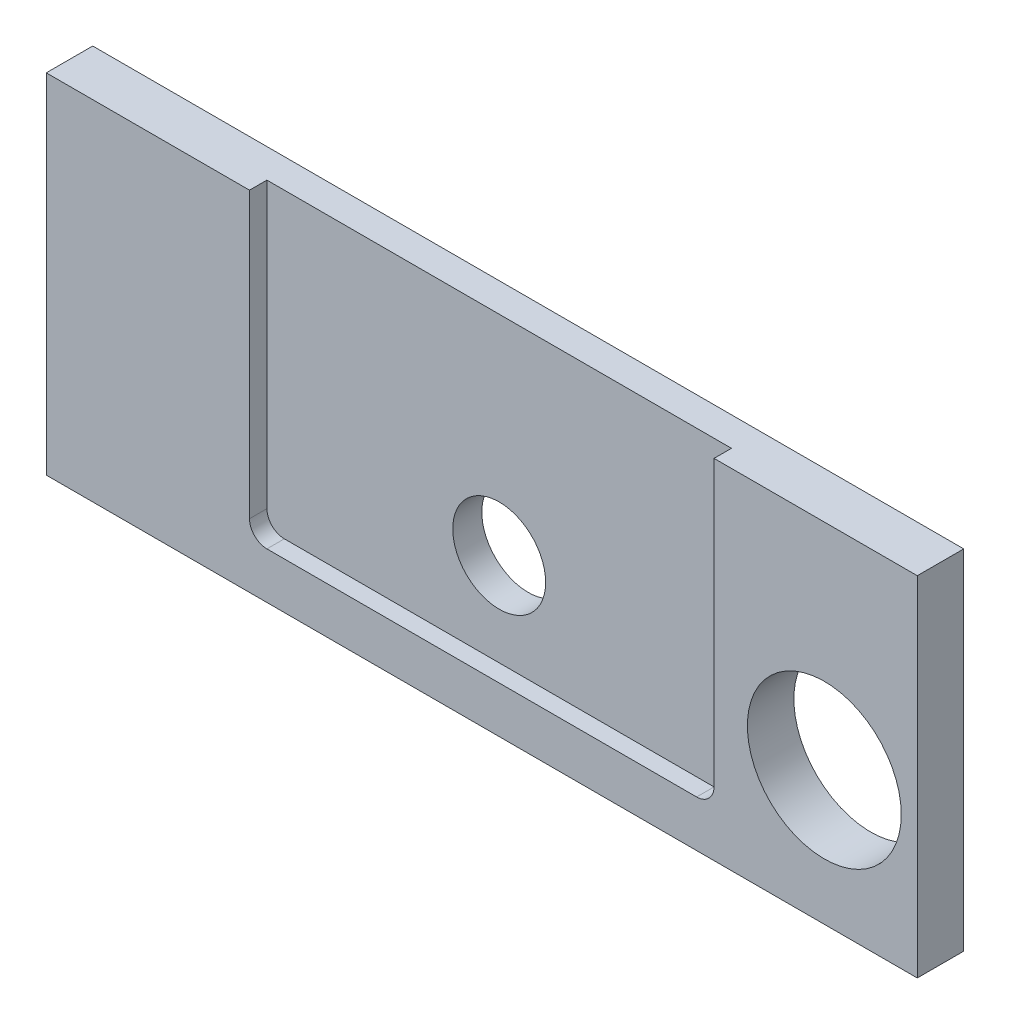
ISO-10303-21;
HEADER;
FILE_DESCRIPTION(('STEP AP214'),'2;1');
FILE_NAME('part.step','',(''),(''),'','','');
FILE_SCHEMA(('AUTOMOTIVE_DESIGN { 1 0 10303 214 1 1 1 1 }'));
ENDSEC;
DATA;
#1=APPLICATION_CONTEXT('core data for automotive mechanical design processes');
#2=APPLICATION_PROTOCOL_DEFINITION('international standard','automotive_design',2000,#1);
#3=PRODUCT_CONTEXT('',#1,'mechanical');
#4=PRODUCT('Part','Part','',(#3));
#5=PRODUCT_RELATED_PRODUCT_CATEGORY('part','',(#4));
#6=PRODUCT_DEFINITION_FORMATION('','',#4);
#7=PRODUCT_DEFINITION_CONTEXT('part definition',#1,'design');
#8=PRODUCT_DEFINITION('design','',#6,#7);
#9=PRODUCT_DEFINITION_SHAPE('','',#8);
#10=(LENGTH_UNIT() NAMED_UNIT(*) SI_UNIT(.MILLI.,.METRE.));
#11=(NAMED_UNIT(*) PLANE_ANGLE_UNIT() SI_UNIT($,.RADIAN.));
#12=(NAMED_UNIT(*) SI_UNIT($,.STERADIAN.) SOLID_ANGLE_UNIT());
#13=UNCERTAINTY_MEASURE_WITH_UNIT(LENGTH_MEASURE(1.E-05),#10,'distance_accuracy_value','');
#14=(GEOMETRIC_REPRESENTATION_CONTEXT(3) GLOBAL_UNCERTAINTY_ASSIGNED_CONTEXT((#13)) GLOBAL_UNIT_ASSIGNED_CONTEXT((#10,
#11,#12)) REPRESENTATION_CONTEXT('',''));
#15=CARTESIAN_POINT('',(0.,0.,0.));
#16=DIRECTION('',(0.,0.,1.));
#17=DIRECTION('',(1.,0.,0.));
#18=AXIS2_PLACEMENT_3D('',#15,#16,#17);
#19=CARTESIAN_POINT('',(115.,60.,5.));
#20=DIRECTION('',(1.,0.,0.));
#21=DIRECTION('',(0.,1.,0.));
#22=AXIS2_PLACEMENT_3D('',#19,#20,#21);
#23=PLANE('',#22);
#24=DIRECTION('',(0.,1.,0.));
#25=VECTOR('',#24,1.);
#26=CARTESIAN_POINT('',(115.,60.,5.));
#27=LINE('',#26,#25);
#28=CARTESIAN_POINT('',(115.,11.,5.));
#29=VERTEX_POINT('',#28);
#30=CARTESIAN_POINT('',(115.,60.,5.));
#31=VERTEX_POINT('',#30);
#32=EDGE_CURVE('E112',#29,#31,#27,.T.);
#33=ORIENTED_EDGE('',*,*,#32,.F.);
#34=DIRECTION('',(0.,0.,-1.));
#35=VECTOR('',#34,1.);
#36=CARTESIAN_POINT('',(115.,11.,8.));
#37=LINE('',#36,#35);
#38=CARTESIAN_POINT('',(115.,11.,8.));
#39=VERTEX_POINT('',#38);
#40=EDGE_CURVE('E49',#29,#39,#37,.F.);
#41=ORIENTED_EDGE('',*,*,#40,.T.);
#42=DIRECTION('',(0.,1.,0.));
#43=VECTOR('',#42,1.);
#44=CARTESIAN_POINT('',(115.,60.,8.));
#45=LINE('',#44,#43);
#46=CARTESIAN_POINT('',(115.,60.,8.));
#47=VERTEX_POINT('',#46);
#48=EDGE_CURVE('E125',#39,#47,#45,.T.);
#49=ORIENTED_EDGE('',*,*,#48,.T.);
#50=DIRECTION('',(0.,0.,1.));
#51=VECTOR('',#50,1.);
#52=CARTESIAN_POINT('',(115.,60.,5.));
#53=LINE('',#52,#51);
#54=EDGE_CURVE('E124',#31,#47,#53,.T.);
#55=ORIENTED_EDGE('',*,*,#54,.F.);
#56=EDGE_LOOP('',(#33,#41,#49,#55));
#57=FACE_BOUND('',#56,.T.);
#58=ADVANCED_FACE('F34',(#57),#23,.F.);
#59=CARTESIAN_POINT('',(35.,60.,5.));
#60=DIRECTION('',(-1.,0.,0.));
#61=DIRECTION('',(0.,-1.,0.));
#62=AXIS2_PLACEMENT_3D('',#59,#60,#61);
#63=PLANE('',#62);
#64=DIRECTION('',(0.,-1.,0.));
#65=VECTOR('',#64,1.);
#66=CARTESIAN_POINT('',(35.,60.,8.));
#67=LINE('',#66,#65);
#68=CARTESIAN_POINT('',(35.,60.,8.));
#69=VERTEX_POINT('',#68);
#70=CARTESIAN_POINT('',(35.,11.,8.));
#71=VERTEX_POINT('',#70);
#72=EDGE_CURVE('E121',#69,#71,#67,.T.);
#73=ORIENTED_EDGE('',*,*,#72,.T.);
#74=DIRECTION('',(0.,0.,-1.));
#75=VECTOR('',#74,1.);
#76=CARTESIAN_POINT('',(35.,11.,5.));
#77=LINE('',#76,#75);
#78=CARTESIAN_POINT('',(35.,11.,5.));
#79=VERTEX_POINT('',#78);
#80=EDGE_CURVE('E174',#71,#79,#77,.T.);
#81=ORIENTED_EDGE('',*,*,#80,.T.);
#82=DIRECTION('',(0.,-1.,0.));
#83=VECTOR('',#82,1.);
#84=CARTESIAN_POINT('',(35.,60.,5.));
#85=LINE('',#84,#83);
#86=CARTESIAN_POINT('',(35.,60.,5.));
#87=VERTEX_POINT('',#86);
#88=EDGE_CURVE('E130',#87,#79,#85,.T.);
#89=ORIENTED_EDGE('',*,*,#88,.F.);
#90=DIRECTION('',(0.,0.,1.));
#91=VECTOR('',#90,1.);
#92=CARTESIAN_POINT('',(35.,60.,5.));
#93=LINE('',#92,#91);
#94=EDGE_CURVE('E129',#87,#69,#93,.T.);
#95=ORIENTED_EDGE('',*,*,#94,.T.);
#96=EDGE_LOOP('',(#73,#81,#89,#95));
#97=FACE_BOUND('',#96,.T.);
#98=ADVANCED_FACE('F195',(#97),#63,.F.);
#99=CARTESIAN_POINT('',(0.,0.,5.));
#100=DIRECTION('',(0.,0.,1.));
#101=DIRECTION('',(1.,0.,0.));
#102=AXIS2_PLACEMENT_3D('',#99,#100,#101);
#103=PLANE('',#102);
#104=CARTESIAN_POINT('',(75.,24.,5.));
#105=DIRECTION('',(0.,0.,1.));
#106=DIRECTION('',(1.,0.,0.));
#107=AXIS2_PLACEMENT_3D('',#104,#105,#106);
#108=CIRCLE('',#107,8.00000000000001);
#109=CARTESIAN_POINT('',(83.,24.,5.));
#110=VERTEX_POINT('',#109);
#111=EDGE_CURVE('E139',#110,#110,#108,.T.);
#112=ORIENTED_EDGE('',*,*,#111,.F.);
#113=EDGE_LOOP('',(#112));
#114=FACE_BOUND('',#113,.T.);
#115=ORIENTED_EDGE('',*,*,#88,.T.);
#116=CARTESIAN_POINT('',(38.,11.,5.));
#117=DIRECTION('',(0.,0.,1.));
#118=DIRECTION('',(1.,0.,0.));
#119=AXIS2_PLACEMENT_3D('',#116,#117,#118);
#120=CIRCLE('',#119,3.);
#121=CARTESIAN_POINT('',(38.,8.,5.));
#122=VERTEX_POINT('',#121);
#123=EDGE_CURVE('E181',#79,#122,#120,.T.);
#124=ORIENTED_EDGE('',*,*,#123,.T.);
#125=DIRECTION('',(-1.,0.,0.));
#126=VECTOR('',#125,1.);
#127=CARTESIAN_POINT('',(35.,8.,5.));
#128=LINE('',#127,#126);
#129=CARTESIAN_POINT('',(112.,8.,5.));
#130=VERTEX_POINT('',#129);
#131=EDGE_CURVE('E197',#130,#122,#128,.T.);
#132=ORIENTED_EDGE('',*,*,#131,.F.);
#133=CARTESIAN_POINT('',(112.,11.,5.));
#134=DIRECTION('',(0.,0.,1.));
#135=DIRECTION('',(1.,0.,0.));
#136=AXIS2_PLACEMENT_3D('',#133,#134,#135);
#137=CIRCLE('',#136,3.);
#138=EDGE_CURVE('E120',#130,#29,#137,.T.);
#139=ORIENTED_EDGE('',*,*,#138,.T.);
#140=ORIENTED_EDGE('',*,*,#32,.T.);
#141=DIRECTION('',(-1.,0.,0.));
#142=VECTOR('',#141,1.);
#143=CARTESIAN_POINT('',(115.,60.,5.));
#144=LINE('',#143,#142);
#145=EDGE_CURVE('E117',#31,#87,#144,.T.);
#146=ORIENTED_EDGE('',*,*,#145,.T.);
#147=EDGE_LOOP('',(#115,#124,#132,#139,#140,#146));
#148=FACE_BOUND('',#147,.T.);
#149=ADVANCED_FACE('F115',(#114,#148),#103,.T.);
#150=CARTESIAN_POINT('',(0.,0.,8.));
#151=DIRECTION('',(1.,0.,0.));
#152=DIRECTION('',(0.,0.,-1.));
#153=AXIS2_PLACEMENT_3D('',#150,#151,#152);
#154=PLANE('',#153);
#155=DIRECTION('',(0.,-1.,0.));
#156=VECTOR('',#155,1.);
#157=CARTESIAN_POINT('',(0.,0.,0.));
#158=LINE('',#157,#156);
#159=CARTESIAN_POINT('',(0.,60.,0.));
#160=VERTEX_POINT('',#159);
#161=CARTESIAN_POINT('',(0.,0.,0.));
#162=VERTEX_POINT('',#161);
#163=EDGE_CURVE('E142',#160,#162,#158,.T.);
#164=ORIENTED_EDGE('',*,*,#163,.T.);
#165=DIRECTION('',(0.,0.,-1.));
#166=VECTOR('',#165,1.);
#167=CARTESIAN_POINT('',(0.,0.,8.));
#168=LINE('',#167,#166);
#169=CARTESIAN_POINT('',(0.,0.,8.));
#170=VERTEX_POINT('',#169);
#171=EDGE_CURVE('E171',#170,#162,#168,.T.);
#172=ORIENTED_EDGE('',*,*,#171,.F.);
#173=DIRECTION('',(0.,-1.,0.));
#174=VECTOR('',#173,1.);
#175=CARTESIAN_POINT('',(0.,0.,8.));
#176=LINE('',#175,#174);
#177=CARTESIAN_POINT('',(0.,60.,8.));
#178=VERTEX_POINT('',#177);
#179=EDGE_CURVE('E144',#178,#170,#176,.T.);
#180=ORIENTED_EDGE('',*,*,#179,.F.);
#181=DIRECTION('',(0.,0.,-1.));
#182=VECTOR('',#181,1.);
#183=CARTESIAN_POINT('',(0.,60.,8.));
#184=LINE('',#183,#182);
#185=EDGE_CURVE('E155',#178,#160,#184,.T.);
#186=ORIENTED_EDGE('',*,*,#185,.T.);
#187=EDGE_LOOP('',(#164,#172,#180,#186));
#188=FACE_BOUND('',#187,.T.);
#189=ADVANCED_FACE('F245',(#188),#154,.F.);
#190=CARTESIAN_POINT('',(0.,0.,8.));
#191=DIRECTION('',(0.,1.,0.));
#192=DIRECTION('',(0.,0.,1.));
#193=AXIS2_PLACEMENT_3D('',#190,#191,#192);
#194=PLANE('',#193);
#195=DIRECTION('',(0.,0.,-1.));
#196=VECTOR('',#195,1.);
#197=CARTESIAN_POINT('',(150.,0.,8.));
#198=LINE('',#197,#196);
#199=CARTESIAN_POINT('',(150.,0.,8.));
#200=VERTEX_POINT('',#199);
#201=CARTESIAN_POINT('',(150.,0.,0.));
#202=VERTEX_POINT('',#201);
#203=EDGE_CURVE('E168',#200,#202,#198,.T.);
#204=ORIENTED_EDGE('',*,*,#203,.F.);
#205=DIRECTION('',(1.,0.,0.));
#206=VECTOR('',#205,1.);
#207=CARTESIAN_POINT('',(0.,0.,8.));
#208=LINE('',#207,#206);
#209=EDGE_CURVE('E147',#170,#200,#208,.T.);
#210=ORIENTED_EDGE('',*,*,#209,.F.);
#211=ORIENTED_EDGE('',*,*,#171,.T.);
#212=DIRECTION('',(1.,0.,0.));
#213=VECTOR('',#212,1.);
#214=CARTESIAN_POINT('',(0.,0.,0.));
#215=LINE('',#214,#213);
#216=EDGE_CURVE('E158',#162,#202,#215,.T.);
#217=ORIENTED_EDGE('',*,*,#216,.T.);
#218=EDGE_LOOP('',(#204,#210,#211,#217));
#219=FACE_BOUND('',#218,.T.);
#220=ADVANCED_FACE('F241',(#219),#194,.F.);
#221=CARTESIAN_POINT('',(150.,0.,8.));
#222=DIRECTION('',(-1.,0.,0.));
#223=DIRECTION('',(0.,0.,1.));
#224=AXIS2_PLACEMENT_3D('',#221,#222,#223);
#225=PLANE('',#224);
#226=DIRECTION('',(0.,1.,0.));
#227=VECTOR('',#226,1.);
#228=CARTESIAN_POINT('',(150.,0.,0.));
#229=LINE('',#228,#227);
#230=CARTESIAN_POINT('',(150.,60.,0.));
#231=VERTEX_POINT('',#230);
#232=EDGE_CURVE('E160',#202,#231,#229,.T.);
#233=ORIENTED_EDGE('',*,*,#232,.T.);
#234=DIRECTION('',(0.,0.,-1.));
#235=VECTOR('',#234,1.);
#236=CARTESIAN_POINT('',(150.,60.,8.));
#237=LINE('',#236,#235);
#238=CARTESIAN_POINT('',(150.,60.,8.));
#239=VERTEX_POINT('',#238);
#240=EDGE_CURVE('E165',#239,#231,#237,.T.);
#241=ORIENTED_EDGE('',*,*,#240,.F.);
#242=DIRECTION('',(0.,1.,0.));
#243=VECTOR('',#242,1.);
#244=CARTESIAN_POINT('',(150.,0.,8.));
#245=LINE('',#244,#243);
#246=EDGE_CURVE('E150',#200,#239,#245,.T.);
#247=ORIENTED_EDGE('',*,*,#246,.F.);
#248=ORIENTED_EDGE('',*,*,#203,.T.);
#249=EDGE_LOOP('',(#233,#241,#247,#248));
#250=FACE_BOUND('',#249,.T.);
#251=ADVANCED_FACE('F238',(#250),#225,.F.);
#252=CARTESIAN_POINT('',(0.,60.,8.));
#253=DIRECTION('',(0.,-1.,0.));
#254=DIRECTION('',(0.,0.,-1.));
#255=AXIS2_PLACEMENT_3D('',#252,#253,#254);
#256=PLANE('',#255);
#257=ORIENTED_EDGE('',*,*,#145,.F.);
#258=ORIENTED_EDGE('',*,*,#54,.T.);
#259=DIRECTION('',(-1.,0.,0.));
#260=VECTOR('',#259,1.);
#261=CARTESIAN_POINT('',(0.,60.,8.));
#262=LINE('',#261,#260);
#263=EDGE_CURVE('E153',#239,#47,#262,.T.);
#264=ORIENTED_EDGE('',*,*,#263,.F.);
#265=ORIENTED_EDGE('',*,*,#240,.T.);
#266=DIRECTION('',(-1.,0.,0.));
#267=VECTOR('',#266,1.);
#268=CARTESIAN_POINT('',(0.,60.,0.));
#269=LINE('',#268,#267);
#270=EDGE_CURVE('E148',#231,#160,#269,.T.);
#271=ORIENTED_EDGE('',*,*,#270,.T.);
#272=ORIENTED_EDGE('',*,*,#185,.F.);
#273=EDGE_CURVE('E152',#69,#178,#262,.T.);
#274=ORIENTED_EDGE('',*,*,#273,.F.);
#275=ORIENTED_EDGE('',*,*,#94,.F.);
#276=EDGE_LOOP('',(#257,#258,#264,#265,#271,#272,#274,#275));
#277=FACE_BOUND('',#276,.T.);
#278=ADVANCED_FACE('F132',(#277),#256,.F.);
#279=CARTESIAN_POINT('',(0.,0.,8.));
#280=DIRECTION('',(0.,0.,-1.));
#281=DIRECTION('',(-1.,0.,0.));
#282=AXIS2_PLACEMENT_3D('',#279,#280,#281);
#283=PLANE('',#282);
#284=CARTESIAN_POINT('',(133.991524815011,23.,8.));
#285=DIRECTION('',(0.,0.,1.));
#286=DIRECTION('',(1.,0.,0.));
#287=AXIS2_PLACEMENT_3D('',#284,#285,#286);
#288=CIRCLE('',#287,13.25);
#289=CARTESIAN_POINT('',(147.241524815011,23.,8.));
#290=VERTEX_POINT('',#289);
#291=EDGE_CURVE('E204',#290,#290,#288,.T.);
#292=ORIENTED_EDGE('',*,*,#291,.F.);
#293=EDGE_LOOP('',(#292));
#294=FACE_BOUND('',#293,.T.);
#295=ORIENTED_EDGE('',*,*,#209,.T.);
#296=ORIENTED_EDGE('',*,*,#246,.T.);
#297=ORIENTED_EDGE('',*,*,#263,.T.);
#298=ORIENTED_EDGE('',*,*,#48,.F.);
#299=CARTESIAN_POINT('',(112.,11.,8.));
#300=DIRECTION('',(0.,0.,-1.));
#301=DIRECTION('',(-1.,0.,0.));
#302=AXIS2_PLACEMENT_3D('',#299,#300,#301);
#303=CIRCLE('',#302,3.);
#304=CARTESIAN_POINT('',(112.,8.,8.));
#305=VERTEX_POINT('',#304);
#306=EDGE_CURVE('E11',#39,#305,#303,.T.);
#307=ORIENTED_EDGE('',*,*,#306,.T.);
#308=DIRECTION('',(-1.,0.,0.));
#309=VECTOR('',#308,1.);
#310=CARTESIAN_POINT('',(35.,8.,8.));
#311=LINE('',#310,#309);
#312=CARTESIAN_POINT('',(38.,8.,8.));
#313=VERTEX_POINT('',#312);
#314=EDGE_CURVE('E191',#305,#313,#311,.T.);
#315=ORIENTED_EDGE('',*,*,#314,.T.);
#316=CARTESIAN_POINT('',(38.,11.,8.));
#317=DIRECTION('',(0.,0.,-1.));
#318=DIRECTION('',(-1.,0.,0.));
#319=AXIS2_PLACEMENT_3D('',#316,#317,#318);
#320=CIRCLE('',#319,3.);
#321=EDGE_CURVE('E42',#313,#71,#320,.T.);
#322=ORIENTED_EDGE('',*,*,#321,.T.);
#323=ORIENTED_EDGE('',*,*,#72,.F.);
#324=ORIENTED_EDGE('',*,*,#273,.T.);
#325=ORIENTED_EDGE('',*,*,#179,.T.);
#326=EDGE_LOOP('',(#295,#296,#297,#298,#307,#315,#322,#323,#324,#325));
#327=FACE_BOUND('',#326,.T.);
#328=ADVANCED_FACE('F190',(#294,#327),#283,.F.);
#329=CARTESIAN_POINT('',(0.,0.,0.));
#330=DIRECTION('',(0.,0.,-1.));
#331=DIRECTION('',(-1.,0.,0.));
#332=AXIS2_PLACEMENT_3D('',#329,#330,#331);
#333=PLANE('',#332);
#334=CARTESIAN_POINT('',(133.991524815011,23.,0.));
#335=DIRECTION('',(0.,0.,1.));
#336=DIRECTION('',(1.,0.,0.));
#337=AXIS2_PLACEMENT_3D('',#334,#335,#336);
#338=CIRCLE('',#337,13.25);
#339=CARTESIAN_POINT('',(147.241524815011,23.,0.));
#340=VERTEX_POINT('',#339);
#341=EDGE_CURVE('E200',#340,#340,#338,.T.);
#342=ORIENTED_EDGE('',*,*,#341,.T.);
#343=EDGE_LOOP('',(#342));
#344=FACE_BOUND('',#343,.T.);
#345=CARTESIAN_POINT('',(75.,24.,0.));
#346=DIRECTION('',(0.,0.,1.));
#347=DIRECTION('',(1.,0.,0.));
#348=AXIS2_PLACEMENT_3D('',#345,#346,#347);
#349=CIRCLE('',#348,8.00000000000001);
#350=CARTESIAN_POINT('',(83.,24.,0.));
#351=VERTEX_POINT('',#350);
#352=EDGE_CURVE('E177',#351,#351,#349,.T.);
#353=ORIENTED_EDGE('',*,*,#352,.T.);
#354=EDGE_LOOP('',(#353));
#355=FACE_BOUND('',#354,.T.);
#356=ORIENTED_EDGE('',*,*,#163,.F.);
#357=ORIENTED_EDGE('',*,*,#270,.F.);
#358=ORIENTED_EDGE('',*,*,#232,.F.);
#359=ORIENTED_EDGE('',*,*,#216,.F.);
#360=EDGE_LOOP('',(#356,#357,#358,#359));
#361=FACE_BOUND('',#360,.T.);
#362=ADVANCED_FACE('F210',(#344,#355,#361),#333,.T.);
#363=CARTESIAN_POINT('',(75.,24.,0.));
#364=DIRECTION('',(0.,0.,1.));
#365=DIRECTION('',(1.,0.,0.));
#366=AXIS2_PLACEMENT_3D('',#363,#364,#365);
#367=CYLINDRICAL_SURFACE('',#366,8.00000000000001);
#368=ORIENTED_EDGE('',*,*,#111,.T.);
#369=EDGE_LOOP('',(#368));
#370=FACE_BOUND('',#369,.T.);
#371=ORIENTED_EDGE('',*,*,#352,.F.);
#372=EDGE_LOOP('',(#371));
#373=FACE_BOUND('',#372,.T.);
#374=ADVANCED_FACE('F213',(#370,#373),#367,.F.);
#375=CARTESIAN_POINT('',(35.,8.,8.));
#376=DIRECTION('',(0.,-1.,0.));
#377=DIRECTION('',(0.,0.,-1.));
#378=AXIS2_PLACEMENT_3D('',#375,#376,#377);
#379=PLANE('',#378);
#380=ORIENTED_EDGE('',*,*,#131,.T.);
#381=DIRECTION('',(0.,0.,-1.));
#382=VECTOR('',#381,1.);
#383=CARTESIAN_POINT('',(38.,8.,8.));
#384=LINE('',#383,#382);
#385=EDGE_CURVE('E57',#122,#313,#384,.F.);
#386=ORIENTED_EDGE('',*,*,#385,.T.);
#387=ORIENTED_EDGE('',*,*,#314,.F.);
#388=DIRECTION('',(0.,0.,-1.));
#389=VECTOR('',#388,1.);
#390=CARTESIAN_POINT('',(112.,8.,5.));
#391=LINE('',#390,#389);
#392=EDGE_CURVE('E183',#305,#130,#391,.T.);
#393=ORIENTED_EDGE('',*,*,#392,.T.);
#394=EDGE_LOOP('',(#380,#386,#387,#393));
#395=FACE_BOUND('',#394,.T.);
#396=ADVANCED_FACE('F198',(#395),#379,.F.);
#397=CARTESIAN_POINT('',(38.,11.,5.));
#398=DIRECTION('',(0.,0.,1.));
#399=DIRECTION('',(1.,0.,0.));
#400=AXIS2_PLACEMENT_3D('',#397,#398,#399);
#401=CYLINDRICAL_SURFACE('',#400,3.);
#402=ORIENTED_EDGE('',*,*,#321,.F.);
#403=ORIENTED_EDGE('',*,*,#385,.F.);
#404=ORIENTED_EDGE('',*,*,#123,.F.);
#405=ORIENTED_EDGE('',*,*,#80,.F.);
#406=EDGE_LOOP('',(#402,#403,#404,#405));
#407=FACE_BOUND('',#406,.T.);
#408=ADVANCED_FACE('F196',(#407),#401,.F.);
#409=CARTESIAN_POINT('',(112.,11.,8.));
#410=DIRECTION('',(0.,0.,1.));
#411=DIRECTION('',(1.,0.,0.));
#412=AXIS2_PLACEMENT_3D('',#409,#410,#411);
#413=CYLINDRICAL_SURFACE('',#412,3.);
#414=ORIENTED_EDGE('',*,*,#306,.F.);
#415=ORIENTED_EDGE('',*,*,#40,.F.);
#416=ORIENTED_EDGE('',*,*,#138,.F.);
#417=ORIENTED_EDGE('',*,*,#392,.F.);
#418=EDGE_LOOP('',(#414,#415,#416,#417));
#419=FACE_BOUND('',#418,.T.);
#420=ADVANCED_FACE('F36',(#419),#413,.F.);
#421=CARTESIAN_POINT('',(133.991524815011,23.,0.));
#422=DIRECTION('',(0.,0.,1.));
#423=DIRECTION('',(1.,0.,0.));
#424=AXIS2_PLACEMENT_3D('',#421,#422,#423);
#425=CYLINDRICAL_SURFACE('',#424,13.25);
#426=ORIENTED_EDGE('',*,*,#341,.F.);
#427=EDGE_LOOP('',(#426));
#428=FACE_BOUND('',#427,.T.);
#429=ORIENTED_EDGE('',*,*,#291,.T.);
#430=EDGE_LOOP('',(#429));
#431=FACE_BOUND('',#430,.T.);
#432=ADVANCED_FACE('F253',(#428,#431),#425,.F.);
#433=CLOSED_SHELL('',(#58,#98,#149,#189,#220,#251,#278,#328,#362,#374,#396,#408,#420,#432));
#434=MANIFOLD_SOLID_BREP('B2',#433);
#435=ADVANCED_BREP_SHAPE_REPRESENTATION('',(#18,#434),#14);
#436=SHAPE_DEFINITION_REPRESENTATION(#9,#435);
ENDSEC;
END-ISO-10303-21;
